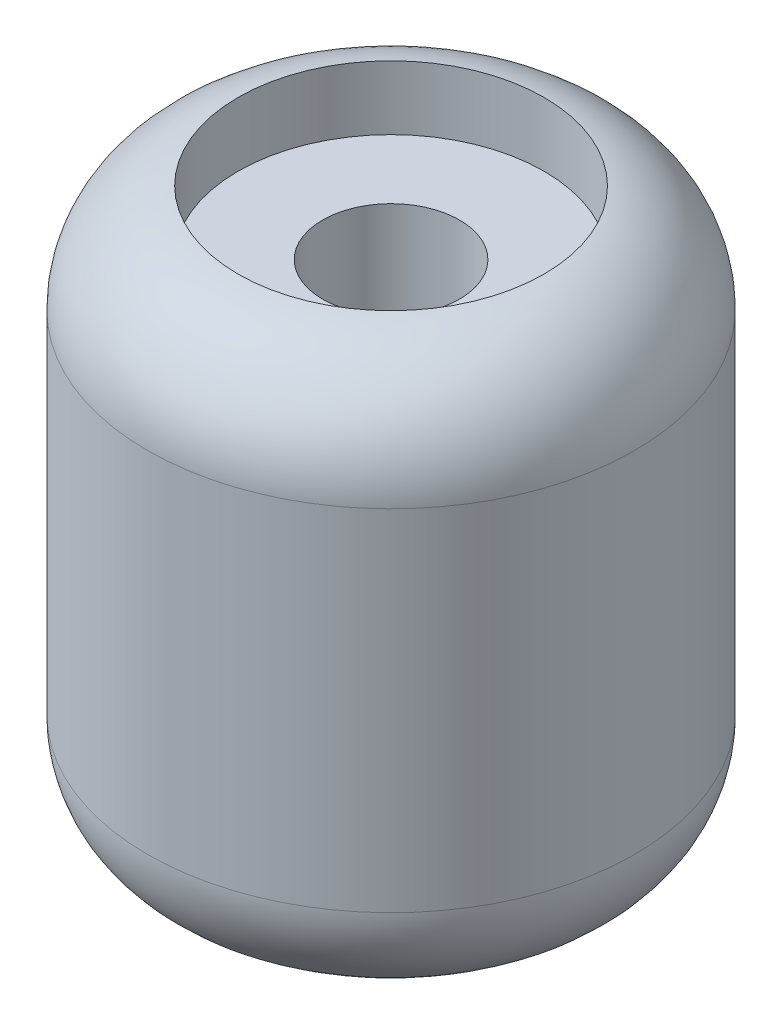
ISO-10303-21;
HEADER;
FILE_DESCRIPTION(('STEP AP214'),'2;1');
FILE_NAME('part.step','',(''),(''),'','','');
FILE_SCHEMA(('AUTOMOTIVE_DESIGN { 1 0 10303 214 1 1 1 1 }'));
ENDSEC;
DATA;
#1=APPLICATION_CONTEXT('core data for automotive mechanical design processes');
#2=APPLICATION_PROTOCOL_DEFINITION('international standard','automotive_design',2000,#1);
#3=PRODUCT_CONTEXT('',#1,'mechanical');
#4=PRODUCT('Part','Part','',(#3));
#5=PRODUCT_RELATED_PRODUCT_CATEGORY('part','',(#4));
#6=PRODUCT_DEFINITION_FORMATION('','',#4);
#7=PRODUCT_DEFINITION_CONTEXT('part definition',#1,'design');
#8=PRODUCT_DEFINITION('design','',#6,#7);
#9=PRODUCT_DEFINITION_SHAPE('','',#8);
#10=(LENGTH_UNIT() NAMED_UNIT(*) SI_UNIT(.MILLI.,.METRE.));
#11=(NAMED_UNIT(*) PLANE_ANGLE_UNIT() SI_UNIT($,.RADIAN.));
#12=(NAMED_UNIT(*) SI_UNIT($,.STERADIAN.) SOLID_ANGLE_UNIT());
#13=UNCERTAINTY_MEASURE_WITH_UNIT(LENGTH_MEASURE(1.E-05),#10,'distance_accuracy_value','');
#14=(GEOMETRIC_REPRESENTATION_CONTEXT(3) GLOBAL_UNCERTAINTY_ASSIGNED_CONTEXT((#13)) GLOBAL_UNIT_ASSIGNED_CONTEXT((#10,
#11,#12)) REPRESENTATION_CONTEXT('',''));
#15=CARTESIAN_POINT('',(0.,0.,0.));
#16=DIRECTION('',(0.,0.,1.));
#17=DIRECTION('',(1.,0.,0.));
#18=AXIS2_PLACEMENT_3D('',#15,#16,#17);
#19=CARTESIAN_POINT('',(0.,13.,0.));
#20=DIRECTION('',(0.,1.,0.));
#21=DIRECTION('',(0.,0.,1.));
#22=AXIS2_PLACEMENT_3D('',#19,#20,#21);
#23=CYLINDRICAL_SURFACE('',#22,3.13420567622914);
#24=CARTESIAN_POINT('',(0.,-13.,0.));
#25=DIRECTION('',(0.,1.,0.));
#26=DIRECTION('',(0.,0.,1.));
#27=AXIS2_PLACEMENT_3D('',#24,#25,#26);
#28=CIRCLE('',#27,3.13420567622914);
#29=CARTESIAN_POINT('',(0.,-13.,3.13420567622914));
#30=VERTEX_POINT('',#29);
#31=EDGE_CURVE('E47',#30,#30,#28,.T.);
#32=ORIENTED_EDGE('',*,*,#31,.F.);
#33=EDGE_LOOP('',(#32));
#34=FACE_BOUND('',#33,.T.);
#35=CARTESIAN_POINT('',(0.,10.,0.));
#36=DIRECTION('',(0.,1.,0.));
#37=DIRECTION('',(0.,0.,1.));
#38=AXIS2_PLACEMENT_3D('',#35,#36,#37);
#39=CIRCLE('',#38,3.13420567622914);
#40=CARTESIAN_POINT('',(0.,10.,3.13420567622914));
#41=VERTEX_POINT('',#40);
#42=EDGE_CURVE('E58',#41,#41,#39,.T.);
#43=ORIENTED_EDGE('',*,*,#42,.T.);
#44=EDGE_LOOP('',(#43));
#45=FACE_BOUND('',#44,.T.);
#46=ADVANCED_FACE('F35',(#34,#45),#23,.F.);
#47=CARTESIAN_POINT('',(0.,-8.,0.));
#48=DIRECTION('',(0.,1.,0.));
#49=DIRECTION('',(0.,0.,1.));
#50=AXIS2_PLACEMENT_3D('',#47,#48,#49);
#51=TOROIDAL_SURFACE('',#50,6.13420567622914,5.);
#52=CARTESIAN_POINT('',(0.,-13.,0.));
#53=DIRECTION('',(0.,1.,0.));
#54=DIRECTION('',(0.,0.,1.));
#55=AXIS2_PLACEMENT_3D('',#52,#53,#54);
#56=CIRCLE('',#55,6.13420567622914);
#57=CARTESIAN_POINT('',(0.,-13.,6.13420567622914));
#58=VERTEX_POINT('',#57);
#59=EDGE_CURVE('E52',#58,#58,#56,.T.);
#60=ORIENTED_EDGE('',*,*,#59,.T.);
#61=EDGE_LOOP('',(#60));
#62=FACE_BOUND('',#61,.T.);
#63=CARTESIAN_POINT('',(0.,-8.,0.));
#64=DIRECTION('',(0.,1.,0.));
#65=DIRECTION('',(0.,0.,1.));
#66=AXIS2_PLACEMENT_3D('',#63,#64,#65);
#67=CIRCLE('',#66,11.1342056762291);
#68=CARTESIAN_POINT('',(0.,-8.,11.1342056762291));
#69=VERTEX_POINT('',#68);
#70=EDGE_CURVE('E10',#69,#69,#67,.T.);
#71=ORIENTED_EDGE('',*,*,#70,.F.);
#72=EDGE_LOOP('',(#71));
#73=FACE_BOUND('',#72,.T.);
#74=ADVANCED_FACE('F37',(#62,#73),#51,.T.);
#75=CARTESIAN_POINT('',(0.,13.,0.));
#76=DIRECTION('',(0.,1.,0.));
#77=DIRECTION('',(0.,0.,1.));
#78=AXIS2_PLACEMENT_3D('',#75,#76,#77);
#79=CYLINDRICAL_SURFACE('',#78,11.1342056762291);
#80=ORIENTED_EDGE('',*,*,#70,.T.);
#81=EDGE_LOOP('',(#80));
#82=FACE_BOUND('',#81,.T.);
#83=CARTESIAN_POINT('',(0.,8.,0.));
#84=DIRECTION('',(0.,1.,0.));
#85=DIRECTION('',(0.,0.,1.));
#86=AXIS2_PLACEMENT_3D('',#83,#84,#85);
#87=CIRCLE('',#86,11.1342056762291);
#88=CARTESIAN_POINT('',(0.,8.,11.1342056762291));
#89=VERTEX_POINT('',#88);
#90=EDGE_CURVE('E43',#89,#89,#87,.T.);
#91=ORIENTED_EDGE('',*,*,#90,.F.);
#92=EDGE_LOOP('',(#91));
#93=FACE_BOUND('',#92,.T.);
#94=ADVANCED_FACE('F87',(#82,#93),#79,.T.);
#95=CARTESIAN_POINT('',(0.,8.,0.));
#96=DIRECTION('',(0.,1.,0.));
#97=DIRECTION('',(0.,0.,1.));
#98=AXIS2_PLACEMENT_3D('',#95,#96,#97);
#99=TOROIDAL_SURFACE('',#98,6.13420567622914,5.);
#100=CARTESIAN_POINT('',(0.,12.9244695337596,0.));
#101=DIRECTION('',(0.,-1.,0.));
#102=DIRECTION('',(0.,0.,-1.));
#103=AXIS2_PLACEMENT_3D('',#100,#101,#102);
#104=CIRCLE('',#103,7.);
#105=CARTESIAN_POINT('',(0.,12.9244695337596,7.));
#106=VERTEX_POINT('',#105);
#107=EDGE_CURVE('E39',#106,#106,#104,.F.);
#108=ORIENTED_EDGE('',*,*,#107,.F.);
#109=EDGE_LOOP('',(#108));
#110=FACE_BOUND('',#109,.T.);
#111=ORIENTED_EDGE('',*,*,#90,.T.);
#112=EDGE_LOOP('',(#111));
#113=FACE_BOUND('',#112,.T.);
#114=ADVANCED_FACE('F77',(#110,#113),#99,.T.);
#115=CARTESIAN_POINT('',(-3.13420567622914,-13.,0.));
#116=DIRECTION('',(0.,-1.,0.));
#117=DIRECTION('',(0.,0.,-1.));
#118=AXIS2_PLACEMENT_3D('',#115,#116,#117);
#119=PLANE('',#118);
#120=ORIENTED_EDGE('',*,*,#31,.T.);
#121=EDGE_LOOP('',(#120));
#122=FACE_BOUND('',#121,.T.);
#123=ORIENTED_EDGE('',*,*,#59,.F.);
#124=EDGE_LOOP('',(#123));
#125=FACE_BOUND('',#124,.T.);
#126=ADVANCED_FACE('F71',(#122,#125),#119,.T.);
#127=CARTESIAN_POINT('',(0.,10.,0.));
#128=DIRECTION('',(0.,1.,0.));
#129=DIRECTION('',(0.,0.,1.));
#130=AXIS2_PLACEMENT_3D('',#127,#128,#129);
#131=CYLINDRICAL_SURFACE('',#130,7.);
#132=CARTESIAN_POINT('',(0.,10.,0.));
#133=DIRECTION('',(0.,1.,0.));
#134=DIRECTION('',(0.,0.,1.));
#135=AXIS2_PLACEMENT_3D('',#132,#133,#134);
#136=CIRCLE('',#135,7.);
#137=CARTESIAN_POINT('',(0.,10.,7.));
#138=VERTEX_POINT('',#137);
#139=EDGE_CURVE('E55',#138,#138,#136,.T.);
#140=CARTESIAN_POINT('',(0.,12.9244695337596,7.));
#141=CARTESIAN_POINT('',(0.,12.8940063094496,7.));
#142=CARTESIAN_POINT('',(0.,12.8635430851396,7.));
#143=CARTESIAN_POINT('',(0.,12.8026166365196,7.));
#144=CARTESIAN_POINT('',(0.,12.7721534122096,7.));
#145=CARTESIAN_POINT('',(0.,12.7112269635896,7.));
#146=CARTESIAN_POINT('',(0.,12.6807637392796,7.));
#147=CARTESIAN_POINT('',(0.,12.6198372906596,7.));
#148=CARTESIAN_POINT('',(0.,12.5893740663496,7.));
#149=CARTESIAN_POINT('',(0.,12.5284476177296,7.));
#150=CARTESIAN_POINT('',(0.,12.4979843934196,7.));
#151=CARTESIAN_POINT('',(0.,12.4370579447996,7.));
#152=CARTESIAN_POINT('',(0.,12.4065947204896,7.));
#153=CARTESIAN_POINT('',(0.,12.3456682718697,7.));
#154=CARTESIAN_POINT('',(0.,12.3152050475597,7.));
#155=CARTESIAN_POINT('',(0.,12.2542785989397,7.));
#156=CARTESIAN_POINT('',(0.,12.2238153746297,7.));
#157=CARTESIAN_POINT('',(0.,12.1628889260097,7.));
#158=CARTESIAN_POINT('',(0.,12.1324257016997,7.));
#159=CARTESIAN_POINT('',(0.,12.0714992530797,7.));
#160=CARTESIAN_POINT('',(0.,12.0410360287697,7.));
#161=CARTESIAN_POINT('',(0.,11.9801095801497,7.));
#162=CARTESIAN_POINT('',(0.,11.9496463558397,7.));
#163=CARTESIAN_POINT('',(0.,11.8887199072197,7.));
#164=CARTESIAN_POINT('',(0.,11.8582566829097,7.));
#165=CARTESIAN_POINT('',(0.,11.7973302342897,7.));
#166=CARTESIAN_POINT('',(0.,11.7668670099797,7.));
#167=CARTESIAN_POINT('',(0.,11.7059405613597,7.));
#168=CARTESIAN_POINT('',(0.,11.6754773370498,7.));
#169=CARTESIAN_POINT('',(0.,11.6145508884298,7.));
#170=CARTESIAN_POINT('',(0.,11.5840876641198,7.));
#171=CARTESIAN_POINT('',(0.,11.5231612154998,7.));
#172=CARTESIAN_POINT('',(0.,11.4926979911898,7.));
#173=CARTESIAN_POINT('',(0.,11.4317715425698,7.));
#174=CARTESIAN_POINT('',(0.,11.4013083182598,7.));
#175=CARTESIAN_POINT('',(0.,11.3403818696398,7.));
#176=CARTESIAN_POINT('',(0.,11.3099186453298,7.));
#177=CARTESIAN_POINT('',(0.,11.2489921967098,7.));
#178=CARTESIAN_POINT('',(0.,11.2185289723998,7.));
#179=CARTESIAN_POINT('',(0.,11.1576025237798,7.));
#180=CARTESIAN_POINT('',(0.,11.1271392994698,7.));
#181=CARTESIAN_POINT('',(0.,11.0662128508498,7.));
#182=CARTESIAN_POINT('',(0.,11.0357496265398,7.));
#183=CARTESIAN_POINT('',(0.,10.9748231779199,7.));
#184=CARTESIAN_POINT('',(0.,10.9443599536099,7.));
#185=CARTESIAN_POINT('',(0.,10.8834335049899,7.));
#186=CARTESIAN_POINT('',(0.,10.8529702806799,7.));
#187=CARTESIAN_POINT('',(0.,10.7920438320599,7.));
#188=CARTESIAN_POINT('',(0.,10.7615806077499,7.));
#189=CARTESIAN_POINT('',(0.,10.7006541591299,7.));
#190=CARTESIAN_POINT('',(0.,10.6701909348199,7.));
#191=CARTESIAN_POINT('',(0.,10.6092644861999,7.));
#192=CARTESIAN_POINT('',(0.,10.5788012618899,7.));
#193=CARTESIAN_POINT('',(0.,10.5178748132699,7.));
#194=CARTESIAN_POINT('',(0.,10.4874115889599,7.));
#195=CARTESIAN_POINT('',(0.,10.4264851403399,7.));
#196=CARTESIAN_POINT('',(0.,10.3960219160299,7.));
#197=CARTESIAN_POINT('',(0.,10.3350954674099,7.));
#198=CARTESIAN_POINT('',(0.,10.3046322431,7.));
#199=CARTESIAN_POINT('',(0.,10.24370579448,7.));
#200=CARTESIAN_POINT('',(0.,10.21324257017,7.));
#201=CARTESIAN_POINT('',(0.,10.15231612155,7.));
#202=CARTESIAN_POINT('',(0.,10.12185289724,7.));
#203=CARTESIAN_POINT('',(0.,10.06092644862,7.));
#204=CARTESIAN_POINT('',(0.,10.03046322431,7.));
#205=CARTESIAN_POINT('',(0.,10.,7.));
#206=B_SPLINE_CURVE_WITH_KNOTS('',3,(#140,#141,#142,#143,#144,#145,#146,#147,#148,#149,#150,
#151,#152,#153,#154,#155,#156,#157,#158,#159,#160,#161,#162,#163,#164,#165,#166,#167,#168,#169,
#170,#171,#172,#173,#174,#175,#176,#177,#178,#179,#180,#181,#182,#183,#184,#185,#186,#187,#188,
#189,#190,#191,#192,#193,#194,#195,#196,#197,#198,#199,#200,#201,#202,#203,#204,#205),
.UNSPECIFIED.,.F.,.F.,(4,2,2,2,2,2,2,2,2,2,2,2,2,2,2,2,2,2,2,2,2,2,2,2,2,2,2,2,2,2,2,2,4),(0.,
0.0913896729299868,0.182779345859974,0.27416901878996,0.365558691719947,0.456948364649934,
0.548338037579921,0.639727710509906,0.731117383439893,0.822507056369879,0.913896729299866,
1.00528640222985,1.09667607515984,1.18806574808983,1.27945542101981,1.3708450939498,
1.46223476687979,1.55362443980977,1.64501411273976,1.73640378566975,1.82779345859973,
1.91918313152972,2.01057280445971,2.10196247738969,2.19335215031968,2.28474182324966,
2.37613149617965,2.46752116910964,2.55891084203962,2.65030051496961,2.7416901878996,
2.83307986082959,2.92446953375957),.UNSPECIFIED.);
#207=EDGE_CURVE('BSEAM66',#106,#138,#206,.T.);
#208=ORIENTED_EDGE('',*,*,#107,.T.);
#209=ORIENTED_EDGE('',*,*,#139,.F.);
#210=ORIENTED_EDGE('',*,*,#207,.T.);
#211=ORIENTED_EDGE('',*,*,#207,.F.);
#212=EDGE_LOOP('',(#208,#210,#209,#211));
#213=FACE_BOUND('',#212,.T.);
#214=ADVANCED_FACE('F66',(#213),#131,.F.);
#215=CARTESIAN_POINT('',(0.,10.,0.));
#216=DIRECTION('',(0.,1.,0.));
#217=DIRECTION('',(0.,0.,1.));
#218=AXIS2_PLACEMENT_3D('',#215,#216,#217);
#219=PLANE('',#218);
#220=ORIENTED_EDGE('',*,*,#42,.F.);
#221=EDGE_LOOP('',(#220));
#222=FACE_BOUND('',#221,.T.);
#223=ORIENTED_EDGE('',*,*,#139,.T.);
#224=EDGE_LOOP('',(#223));
#225=FACE_BOUND('',#224,.T.);
#226=ADVANCED_FACE('F63',(#222,#225),#219,.T.);
#227=CLOSED_SHELL('',(#46,#74,#94,#114,#126,#214,#226));
#228=MANIFOLD_SOLID_BREP('B2',#227);
#229=ADVANCED_BREP_SHAPE_REPRESENTATION('',(#18,#228),#14);
#230=SHAPE_DEFINITION_REPRESENTATION(#9,#229);
ENDSEC;
END-ISO-10303-21;
